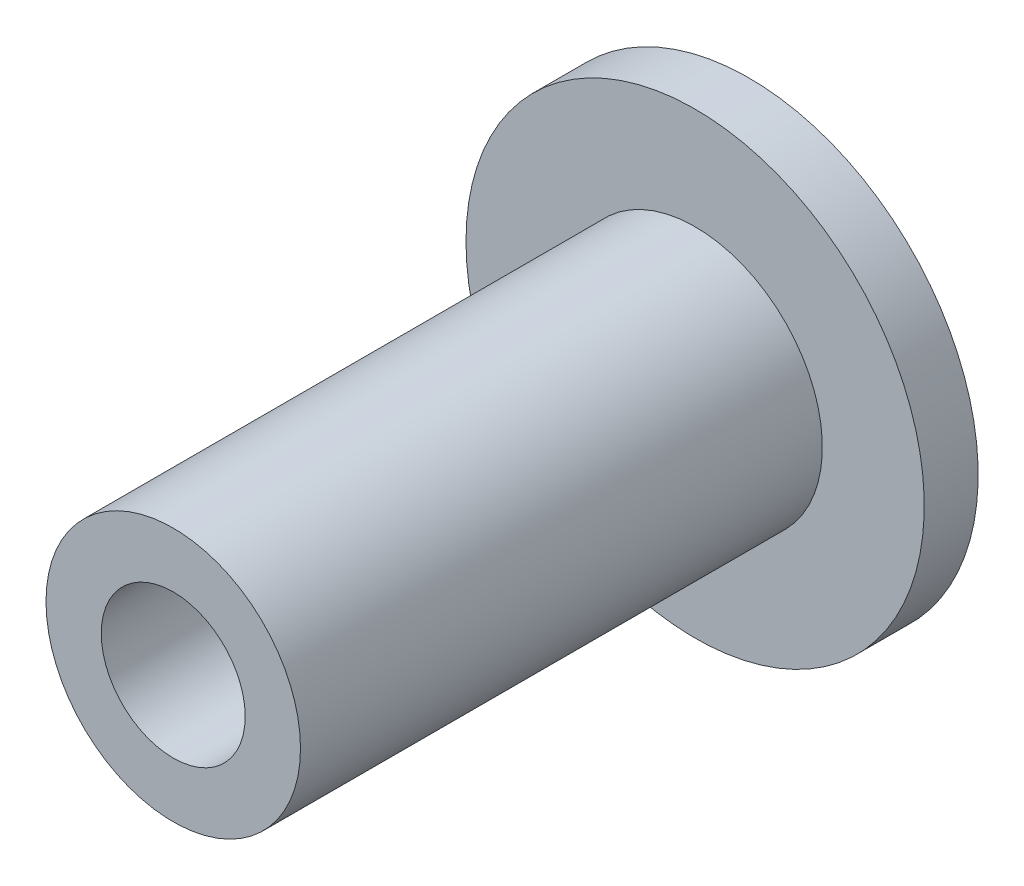
ISO-10303-21;
HEADER;
FILE_DESCRIPTION(('STEP AP214'),'2;1');
FILE_NAME('part.step','',(''),(''),'','','');
FILE_SCHEMA(('AUTOMOTIVE_DESIGN { 1 0 10303 214 1 1 1 1 }'));
ENDSEC;
DATA;
#1=APPLICATION_CONTEXT('core data for automotive mechanical design processes');
#2=APPLICATION_PROTOCOL_DEFINITION('international standard','automotive_design',2000,#1);
#3=PRODUCT_CONTEXT('',#1,'mechanical');
#4=PRODUCT('Part','Part','',(#3));
#5=PRODUCT_RELATED_PRODUCT_CATEGORY('part','',(#4));
#6=PRODUCT_DEFINITION_FORMATION('','',#4);
#7=PRODUCT_DEFINITION_CONTEXT('part definition',#1,'design');
#8=PRODUCT_DEFINITION('design','',#6,#7);
#9=PRODUCT_DEFINITION_SHAPE('','',#8);
#10=(LENGTH_UNIT() NAMED_UNIT(*) SI_UNIT(.MILLI.,.METRE.));
#11=(NAMED_UNIT(*) PLANE_ANGLE_UNIT() SI_UNIT($,.RADIAN.));
#12=(NAMED_UNIT(*) SI_UNIT($,.STERADIAN.) SOLID_ANGLE_UNIT());
#13=UNCERTAINTY_MEASURE_WITH_UNIT(LENGTH_MEASURE(1.E-05),#10,'distance_accuracy_value','');
#14=(GEOMETRIC_REPRESENTATION_CONTEXT(3) GLOBAL_UNCERTAINTY_ASSIGNED_CONTEXT((#13)) GLOBAL_UNIT_ASSIGNED_CONTEXT((#10,
#11,#12)) REPRESENTATION_CONTEXT('',''));
#15=CARTESIAN_POINT('',(0.,0.,0.));
#16=DIRECTION('',(0.,0.,1.));
#17=DIRECTION('',(1.,0.,0.));
#18=AXIS2_PLACEMENT_3D('',#15,#16,#17);
#19=CARTESIAN_POINT('',(0.,0.,10.033));
#20=DIRECTION('',(0.,0.,-1.));
#21=DIRECTION('',(-1.,0.,0.));
#22=AXIS2_PLACEMENT_3D('',#19,#20,#21);
#23=CYLINDRICAL_SURFACE('',#22,5.9944);
#24=CARTESIAN_POINT('',(0.,0.,10.033));
#25=DIRECTION('',(0.,0.,1.));
#26=DIRECTION('',(1.,0.,0.));
#27=AXIS2_PLACEMENT_3D('',#24,#25,#26);
#28=CIRCLE('',#27,5.9944);
#29=CARTESIAN_POINT('',(5.9944,0.,10.033));
#30=VERTEX_POINT('',#29);
#31=EDGE_CURVE('E10',#30,#30,#28,.T.);
#32=ORIENTED_EDGE('',*,*,#31,.F.);
#33=EDGE_LOOP('',(#32));
#34=FACE_BOUND('',#33,.T.);
#35=CARTESIAN_POINT('',(0.,0.,-14.5542));
#36=DIRECTION('',(0.,0.,-1.));
#37=DIRECTION('',(-1.,0.,0.));
#38=AXIS2_PLACEMENT_3D('',#35,#36,#37);
#39=CIRCLE('',#38,5.9944);
#40=CARTESIAN_POINT('',(-5.9944,0.,-14.5542));
#41=VERTEX_POINT('',#40);
#42=EDGE_CURVE('E63',#41,#41,#39,.T.);
#43=ORIENTED_EDGE('',*,*,#42,.F.);
#44=EDGE_LOOP('',(#43));
#45=FACE_BOUND('',#44,.T.);
#46=CARTESIAN_POINT('',(0.,-5.9944,3.7846));
#47=CARTESIAN_POINT('',(-0.130886887564966,-5.99439301047395,3.78459066947051));
#48=CARTESIAN_POINT('',(-0.26197780745453,-5.99006437660331,3.77400109132687));
#49=CARTESIAN_POINT('',(-0.520464069224911,-5.97317559377108,3.73202158823207));
#50=CARTESIAN_POINT('',(-0.64784856916491,-5.96059342244834,3.70057601212357));
#51=CARTESIAN_POINT('',(-0.894753436712238,-5.92854887938121,3.61822188756817));
#52=CARTESIAN_POINT('',(-1.01429838888754,-5.90910936929513,3.56737796580561));
#53=CARTESIAN_POINT('',(-1.24305111550801,-5.86525679802924,3.44793210106671));
#54=CARTESIAN_POINT('',(-1.35226227713629,-5.84084537485882,3.37933600458022));
#55=CARTESIAN_POINT('',(-1.56269275892852,-5.7881866098338,3.2228270746994));
#56=CARTESIAN_POINT('',(-1.66334672333439,-5.7598175298676,3.13419538784217));
#57=CARTESIAN_POINT('',(-1.84884330354453,-5.70298521089813,2.94164952325426));
#58=CARTESIAN_POINT('',(-1.93367795035161,-5.67452193175001,2.83772768999996));
#59=CARTESIAN_POINT('',(-2.08900775439584,-5.61925247309311,2.61170254115946));
#60=CARTESIAN_POINT('',(-2.15865540028879,-5.59258436915329,2.48897953142959));
#61=CARTESIAN_POINT('',(-2.27606719404941,-5.54584285060409,2.2323151859867));
#62=CARTESIAN_POINT('',(-2.32384209058769,-5.52576619820959,2.0983793987985));
#63=CARTESIAN_POINT('',(-2.39384624514471,-5.49579194608517,1.82959303399992));
#64=CARTESIAN_POINT('',(-2.41716027185775,-5.4854643532488,1.69507472212569));
#65=CARTESIAN_POINT('',(-2.44096786332806,-5.47491503998312,1.42366936879247));
#66=CARTESIAN_POINT('',(-2.4414731861731,-5.47468811257264,1.28678358419738));
#67=CARTESIAN_POINT('',(-2.4204690597363,-5.48400012146107,1.02510355843793));
#68=CARTESIAN_POINT('',(-2.40055109422405,-5.49283308204151,0.900151504645107));
#69=CARTESIAN_POINT('',(-2.34192579920706,-5.51808143014421,0.65554661816911));
#70=CARTESIAN_POINT('',(-2.30321506526758,-5.5344981914962,0.53589474993715));
#71=CARTESIAN_POINT('',(-2.20735821709606,-5.57342936141972,0.302343991239938));
#72=CARTESIAN_POINT('',(-2.14984579571161,-5.59606336946918,0.188616273267144));
#73=CARTESIAN_POINT('',(-2.01827599956942,-5.64484789843029,-0.028001996757046));
#74=CARTESIAN_POINT('',(-1.94421228093561,-5.67099976615335,-0.130888371166367));
#75=CARTESIAN_POINT('',(-1.77466500752094,-5.7264263463927,-0.33158590322855));
#76=CARTESIAN_POINT('',(-1.67794007837195,-5.755783314196,-0.428328520856989));
#77=CARTESIAN_POINT('',(-1.46933502974869,-5.81253483626706,-0.604568465272907));
#78=CARTESIAN_POINT('',(-1.35745169142457,-5.83992897183831,-0.684062119934127));
#79=CARTESIAN_POINT('',(-1.11858811131278,-5.89039744588404,-0.825015353178879));
#80=CARTESIAN_POINT('',(-0.991339528561734,-5.91336864732142,-0.88605982928831));
#81=CARTESIAN_POINT('',(-0.727207163586644,-5.95161861589953,-0.985505062524105));
#82=CARTESIAN_POINT('',(-0.590328491624927,-5.96690142835324,-1.02391772939933));
#83=CARTESIAN_POINT('',(-0.319767323622745,-5.98730797373265,-1.07481761109077));
#84=CARTESIAN_POINT('',(-0.186397070893351,-5.99299324122021,-1.08874001120626));
#85=CARTESIAN_POINT('',(0.080883105575183,-5.99534243360918,-1.09451841094271));
#86=CARTESIAN_POINT('',(0.214792873698523,-5.99200879654079,-1.08638037403746));
#87=CARTESIAN_POINT('',(0.472759218251278,-5.97706106180885,-1.04931324131126));
#88=CARTESIAN_POINT('',(0.596983613154315,-5.96584184361111,-1.02137512284999));
#89=CARTESIAN_POINT('',(0.838858673744933,-5.93666555489665,-0.946861654349843));
#90=CARTESIAN_POINT('',(0.956508497911473,-5.9187076241085,-0.900283924707315));
#91=CARTESIAN_POINT('',(1.18597893499103,-5.87710036862634,-0.788290984311527));
#92=CARTESIAN_POINT('',(1.29750821052025,-5.85329271787953,-0.722339532234388));
#93=CARTESIAN_POINT('',(1.5083119469273,-5.80255125413318,-0.574063733842812));
#94=CARTESIAN_POINT('',(1.60758138047034,-5.77561616740695,-0.491732706727733));
#95=CARTESIAN_POINT('',(1.79815842987715,-5.71926553558528,-0.306453335417239));
#96=CARTESIAN_POINT('',(1.88846071067632,-5.68980613883182,-0.202481563982998));
#97=CARTESIAN_POINT('',(2.05059641815415,-5.63340693827743,0.0196411955226845));
#98=CARTESIAN_POINT('',(2.12242635636836,-5.60646761099677,0.137794855644791));
#99=CARTESIAN_POINT('',(2.24615685305721,-5.55806584310736,0.386965599916293));
#100=CARTESIAN_POINT('',(2.29781971208243,-5.53666967035847,0.518114522857342));
#101=CARTESIAN_POINT('',(2.37791194077361,-5.50275327168747,0.788388005565465));
#102=CARTESIAN_POINT('',(2.40635926061291,-5.49022618921054,0.927506314185734));
#103=CARTESIAN_POINT('',(2.43746986061205,-5.47648012464231,1.1986725506339));
#104=CARTESIAN_POINT('',(2.44188589205581,-5.47449271799031,1.33048155518679));
#105=CARTESIAN_POINT('',(2.4294422133011,-5.48002634629648,1.59287457013769));
#106=CARTESIAN_POINT('',(2.41258541982616,-5.4875460777283,1.7234587459994));
#107=CARTESIAN_POINT('',(2.35952288372346,-5.51055882968726,1.97402318700019));
#108=CARTESIAN_POINT('',(2.32416567435,-5.52570116198278,2.09421834650013));
#109=CARTESIAN_POINT('',(2.23591420619935,-5.56199458244378,2.32701065855502));
#110=CARTESIAN_POINT('',(2.1830150688917,-5.58314734191577,2.43960568696558));
#111=CARTESIAN_POINT('',(2.05761194261521,-5.63061298999345,2.66117826166334));
#112=CARTESIAN_POINT('',(1.98414261271039,-5.65715525426382,2.76955949348688));
#113=CARTESIAN_POINT('',(1.82107455161282,-5.71173421523815,2.97300453171964));
#114=CARTESIAN_POINT('',(1.73147065912223,-5.73977138812354,3.06806405928421));
#115=CARTESIAN_POINT('',(1.53141829382244,-5.79647256140869,3.24880976334045));
#116=CARTESIAN_POINT('',(1.41996656919294,-5.82504948743264,3.33341861345493));
#117=CARTESIAN_POINT('',(1.18340899217525,-5.87767503019671,3.48276774604191));
#118=CARTESIAN_POINT('',(1.05829688864781,-5.9017215599435,3.5474988801609));
#119=CARTESIAN_POINT('',(0.799961266708152,-5.94218870245711,3.65378824250297));
#120=CARTESIAN_POINT('',(0.666922500974959,-5.95873783008602,3.69573964879571));
#121=CARTESIAN_POINT('',(0.463234681390629,-5.97686612263372,3.74120794137591));
#122=CARTESIAN_POINT('',(0.394713360075828,-5.98179157038646,3.7534510771913));
#123=CARTESIAN_POINT('',(0.256759690731918,-5.98929477703823,3.77203914813661));
#124=CARTESIAN_POINT('',(0.187328005554844,-5.99187415726971,3.77838815667327));
#125=CARTESIAN_POINT('',(0.0785416806855929,-5.99401497056573,3.78365270072847));
#126=CARTESIAN_POINT('',(0.0392800283279682,-5.99440209760341,3.78460280015416));
#127=CARTESIAN_POINT('',(0.,-5.9944,3.7846));
#128=B_SPLINE_CURVE_WITH_KNOTS('',3,(#46,#47,#48,#49,#50,#51,#52,#53,#54,#55,#56,#57,#58,#59,
#60,#61,#62,#63,#64,#65,#66,#67,#68,#69,#70,#71,#72,#73,#74,#75,#76,#77,#78,#79,#80,#81,#82,#83,
#84,#85,#86,#87,#88,#89,#90,#91,#92,#93,#94,#95,#96,#97,#98,#99,#100,#101,#102,#103,#104,#105,
#106,#107,#108,#109,#110,#111,#112,#113,#114,#115,#116,#117,#118,#119,#120,#121,#122,#123,#124,
#125,#126,#127),.UNSPECIFIED.,.T.,.F.,(4,2,2,2,2,2,2,2,2,2,2,2,2,2,2,2,2,2,2,2,2,2,2,2,2,2,2,2,
2,2,2,2,2,2,2,2,2,2,2,2,4),(0.,0.39252729774372,0.786106233455745,1.17838522953526,
1.57053519674922,1.9799905588279,2.38965163050852,2.81831200124294,3.24676149369655,
3.65528406923982,4.06359604539011,4.44234133938418,4.82115527121974,5.2078395060688,
5.594672206445,6.01252419878205,6.43046506040938,6.85720868540431,7.28372754006026,
7.68429567304518,8.08475553349959,8.46647142826327,8.84823606988368,9.24176461891839,
9.63545400825607,10.0560042386037,10.4766338307855,10.902081405337,11.3271997128189,
11.7208492180858,12.1144447558126,12.491392888209,12.8684459405071,13.2675422980656,
13.6667665504104,14.0931449120524,14.519719213413,14.9386757590115,15.1477816687357,
15.3567429584245,15.4745430196966),.UNSPECIFIED.);
#129=CARTESIAN_POINT('',(0.,-5.9944,3.7846));
#130=VERTEX_POINT('',#129);
#131=EDGE_CURVE('E80',#130,#130,#128,.T.);
#132=ORIENTED_EDGE('',*,*,#131,.F.);
#133=EDGE_LOOP('',(#132));
#134=FACE_BOUND('',#133,.T.);
#135=ADVANCED_FACE('F43',(#34,#45,#134),#23,.T.);
#136=CARTESIAN_POINT('',(0.,0.,10.033));
#137=DIRECTION('',(0.,0.,-1.));
#138=DIRECTION('',(-1.,0.,0.));
#139=AXIS2_PLACEMENT_3D('',#136,#137,#138);
#140=CYLINDRICAL_SURFACE('',#139,3.3909);
#141=CARTESIAN_POINT('',(0.,0.,-17.0942));
#142=DIRECTION('',(0.,0.,-1.));
#143=DIRECTION('',(-1.,0.,0.));
#144=AXIS2_PLACEMENT_3D('',#141,#142,#143);
#145=CIRCLE('',#144,3.3909);
#146=CARTESIAN_POINT('',(-3.3909,0.,-17.0942));
#147=VERTEX_POINT('',#146);
#148=EDGE_CURVE('E76',#147,#147,#145,.T.);
#149=ORIENTED_EDGE('',*,*,#148,.T.);
#150=EDGE_LOOP('',(#149));
#151=FACE_BOUND('',#150,.T.);
#152=CARTESIAN_POINT('',(0.,0.,10.033));
#153=DIRECTION('',(0.,0.,1.));
#154=DIRECTION('',(1.,0.,0.));
#155=AXIS2_PLACEMENT_3D('',#152,#153,#154);
#156=CIRCLE('',#155,3.3909);
#157=CARTESIAN_POINT('',(3.3909,0.,10.033));
#158=VERTEX_POINT('',#157);
#159=EDGE_CURVE('E57',#158,#158,#156,.T.);
#160=ORIENTED_EDGE('',*,*,#159,.T.);
#161=EDGE_LOOP('',(#160));
#162=FACE_BOUND('',#161,.T.);
#163=CARTESIAN_POINT('',(0.,-3.3909,3.7846));
#164=CARTESIAN_POINT('',(-0.120510131857021,-3.39090511226414,3.78460550239903));
#165=CARTESIAN_POINT('',(-0.240992365872244,-3.38442428079192,3.77561808965648));
#166=CARTESIAN_POINT('',(-0.478053993077699,-3.35914922137523,3.74028173700238));
#167=CARTESIAN_POINT('',(-0.594632030680575,-3.34035076224123,3.71392683122018));
#168=CARTESIAN_POINT('',(-0.820068546932916,-3.29225307215049,3.64557083916231));
#169=CARTESIAN_POINT('',(-0.928962391308479,-3.26300629749181,3.60364787234912));
#170=CARTESIAN_POINT('',(-1.13759039726306,-3.19626384832928,3.50605196088222));
#171=CARTESIAN_POINT('',(-1.23732328119222,-3.15876702568614,3.4503771022785));
#172=CARTESIAN_POINT('',(-1.43497075232357,-3.0743494804552,3.32149931915913));
#173=CARTESIAN_POINT('',(-1.53191284194314,-3.02688419402828,3.24716945010823));
#174=CARTESIAN_POINT('',(-1.71281215538571,-2.9283295717289,3.08596371669134));
#175=CARTESIAN_POINT('',(-1.79674949181126,-2.8772348562464,2.99906902240662));
#176=CARTESIAN_POINT('',(-1.96534926556743,-2.76543403720902,2.796604637371));
#177=CARTESIAN_POINT('',(-2.04722586097167,-2.70471307588229,2.67870964158073));
#178=CARTESIAN_POINT('',(-2.19014733792194,-2.59032985833734,2.42778372727253));
#179=CARTESIAN_POINT('',(-2.2512249304665,-2.53665660051916,2.29477701879603));
#180=CARTESIAN_POINT('',(-2.33363455434843,-2.46057447068893,2.06032251995281));
#181=CARTESIAN_POINT('',(-2.36143250281094,-2.43367118899389,1.96262527881524));
#182=CARTESIAN_POINT('',(-2.40480685926309,-2.39082604099109,1.76231563596528));
#183=CARTESIAN_POINT('',(-2.42040959188598,-2.37486057353879,1.65971433142825));
#184=CARTESIAN_POINT('',(-2.43838379192605,-2.35641181353337,1.45138042926221));
#185=CARTESIAN_POINT('',(-2.4406652945238,-2.35402019488019,1.34563137759886));
#186=CARTESIAN_POINT('',(-2.43154908668454,-2.3634302016515,1.13533235473615));
#187=CARTESIAN_POINT('',(-2.42014049334287,-2.37524311894876,1.03078340429014));
#188=CARTESIAN_POINT('',(-2.38235908519635,-2.41316093437235,0.813474781968057));
#189=CARTESIAN_POINT('',(-2.35431230097116,-2.44085062003865,0.701295540169296));
#190=CARTESIAN_POINT('',(-2.28400336159084,-2.50675880081634,0.484715964176813));
#191=CARTESIAN_POINT('',(-2.24170920493009,-2.54500096291531,0.380333793878788));
#192=CARTESIAN_POINT('',(-2.12890356259327,-2.64064812687593,0.148227989190538));
#193=CARTESIAN_POINT('',(-2.05369378441207,-2.70027075189954,0.0237114339603397));
#194=CARTESIAN_POINT('',(-1.88321238568103,-2.82182858835895,-0.209496291258305));
#195=CARTESIAN_POINT('',(-1.787920267837,-2.88376610897665,-0.318171098967873));
#196=CARTESIAN_POINT('',(-1.57716957144278,-3.00427122134659,-0.519209453118687));
#197=CARTESIAN_POINT('',(-1.46150481372837,-3.06279532437023,-0.61138468100104));
#198=CARTESIAN_POINT('',(-1.21219041295227,-3.1697134399386,-0.774760715094408));
#199=CARTESIAN_POINT('',(-1.07858305427825,-3.2181306057051,-0.846009615837444));
#200=CARTESIAN_POINT('',(-0.832594041217747,-3.28891213866272,-0.948471470917665));
#201=CARTESIAN_POINT('',(-0.72353494179048,-3.31477296142874,-0.985264277920814));
#202=CARTESIAN_POINT('',(-0.499424092882594,-3.35584788635797,-1.04330484768109));
#203=CARTESIAN_POINT('',(-0.384376790001447,-3.37106977072475,-1.06456397358167));
#204=CARTESIAN_POINT('',(-0.151055703859422,-3.38956062934246,-1.09035388397408));
#205=CARTESIAN_POINT('',(-0.032772447737085,-3.39278960990251,-1.0948286969709));
#206=CARTESIAN_POINT('',(0.202886903489984,-3.3868764815897,-1.08660340026116));
#207=CARTESIAN_POINT('',(0.320262921276882,-3.37773332976329,-1.07390184261047));
#208=CARTESIAN_POINT('',(0.544628439682804,-3.3486926568281,-1.03319548218151));
#209=CARTESIAN_POINT('',(0.651842718511451,-3.32936468465171,-1.00600033943656));
#210=CARTESIAN_POINT('',(0.859818215416288,-3.28181467050271,-0.938199650376709));
#211=CARTESIAN_POINT('',(0.960578107492356,-3.25359080794964,-0.897591358924256));
#212=CARTESIAN_POINT('',(1.16256691170258,-3.18730568956067,-0.800398646998452));
#213=CARTESIAN_POINT('',(1.26305227985727,-3.14859603390282,-0.742720485893404));
#214=CARTESIAN_POINT('',(1.45330791890769,-3.06543635568419,-0.615134510793003));
#215=CARTESIAN_POINT('',(1.54307022681871,-3.02098211754662,-0.545217702153065));
#216=CARTESIAN_POINT('',(1.7265142731382,-2.92064457580465,-0.380865525269685));
#217=CARTESIAN_POINT('',(1.81794086796266,-2.86415289086994,-0.284283549762545));
#218=CARTESIAN_POINT('',(1.98415863897799,-2.75161513935701,-0.0773658272647317));
#219=CARTESIAN_POINT('',(2.05893923364988,-2.69556937794358,0.0329785990979532));
#220=CARTESIAN_POINT('',(2.18110872324855,-2.59734562516423,0.24995234088317));
#221=CARTESIAN_POINT('',(2.23088662419569,-2.55433105090935,0.354850988203598));
#222=CARTESIAN_POINT('',(2.31572750527125,-2.47767760814026,0.573610681546666));
#223=CARTESIAN_POINT('',(2.35082152231212,-2.44401901525302,0.687452213664617));
#224=CARTESIAN_POINT('',(2.39903256167471,-2.39661573736108,0.899221913235879));
#225=CARTESIAN_POINT('',(2.41511536441062,-2.3802556761467,0.995873048149068));
#226=CARTESIAN_POINT('',(2.43547862059919,-2.35942249790517,1.19163458945356));
#227=CARTESIAN_POINT('',(2.43977361262722,-2.3549347383421,1.29074181416479));
#228=CARTESIAN_POINT('',(2.4362522137227,-2.35857598897525,1.4885511531747));
#229=CARTESIAN_POINT('',(2.42842885553185,-2.36671225716575,1.58725300169075));
#230=CARTESIAN_POINT('',(2.40124439864475,-2.39428211867338,1.78148610875586));
#231=CARTESIAN_POINT('',(2.38186525447855,-2.41373338027487,1.87701216115046));
#232=CARTESIAN_POINT('',(2.32459805866025,-2.4691068827414,2.09342326747422));
#233=CARTESIAN_POINT('',(2.28273053534655,-2.50833474868076,2.21239096763003));
#234=CARTESIAN_POINT('',(2.18294239164406,-2.59564179154191,2.43984161382978));
#235=CARTESIAN_POINT('',(2.12499492209276,-2.64373572692272,2.54830661099401));
#236=CARTESIAN_POINT('',(1.99270307079842,-2.74489860961975,2.75709019043378));
#237=CARTESIAN_POINT('',(1.9179462346493,-2.79806893818878,2.85709696316452));
#238=CARTESIAN_POINT('',(1.75387396042095,-2.90373320721948,3.04480684541121));
#239=CARTESIAN_POINT('',(1.6645534510534,-2.95622690517297,3.13250564924399));
#240=CARTESIAN_POINT('',(1.45379167970423,-3.06616036264326,3.30951542221234));
#241=CARTESIAN_POINT('',(1.32946871542772,-3.12267408874085,3.39602867361472));
#242=CARTESIAN_POINT('',(1.06300907363255,-3.22310100454232,3.54598643444176));
#243=CARTESIAN_POINT('',(0.92089811556938,-3.26703209170956,3.60946374472775));
#244=CARTESIAN_POINT('',(0.649687608707201,-3.33045266618485,3.69999347442849));
#245=CARTESIAN_POINT('',(0.522783541205905,-3.35290291863069,3.73152156591926));
#246=CARTESIAN_POINT('',(0.263904198402809,-3.38311473340341,3.77380901529075));
#247=CARTESIAN_POINT('',(0.131935379980629,-3.39089440305556,3.78459397593301));
#248=CARTESIAN_POINT('',(0.,-3.3909,3.7846));
#249=B_SPLINE_CURVE_WITH_KNOTS('',3,(#163,#164,#165,#166,#167,#168,#169,#170,#171,#172,#173,
#174,#175,#176,#177,#178,#179,#180,#181,#182,#183,#184,#185,#186,#187,#188,#189,#190,#191,#192,
#193,#194,#195,#196,#197,#198,#199,#200,#201,#202,#203,#204,#205,#206,#207,#208,#209,#210,#211,
#212,#213,#214,#215,#216,#217,#218,#219,#220,#221,#222,#223,#224,#225,#226,#227,#228,#229,#230,
#231,#232,#233,#234,#235,#236,#237,#238,#239,#240,#241,#242,#243,#244,#245,#246,#247,#248),
.UNSPECIFIED.,.T.,.F.,(4,2,2,2,2,2,2,2,2,2,2,2,2,2,2,2,2,2,2,2,2,2,2,2,2,2,2,2,2,2,2,2,2,2,2,2,
2,2,2,2,2,2,4),(0.,0.360995252114135,0.72211457362605,1.08144578450293,1.4408270343043,
1.83257103362403,2.22490831333327,2.69043629775224,3.15522871882518,3.46931677948355,
3.78272496165204,4.09824731724213,4.41402066272401,4.76878928113203,5.12436013036195,
5.59361224765026,6.06334565297371,6.53813911378085,7.01183267134642,7.36425823451991,
7.71642573378468,8.06976658497092,8.42313722415564,8.75856777194879,9.09406701160125,
9.45917814068521,9.82455873906365,10.2563774945491,10.6884699693545,11.0586879994898,
11.4281195081658,11.7248510789448,12.0212165090357,12.3177523931074,12.6147525636175,
13.008833703223,13.4035768527405,13.8093359585137,14.2152366585987,14.6974619383242,
15.1789978583769,15.5747068479017,15.9699271088453),.UNSPECIFIED.);
#250=CARTESIAN_POINT('',(0.,-3.3909,3.7846));
#251=VERTEX_POINT('',#250);
#252=EDGE_CURVE('E47',#251,#251,#249,.T.);
#253=ORIENTED_EDGE('',*,*,#252,.T.);
#254=EDGE_LOOP('',(#253));
#255=FACE_BOUND('',#254,.T.);
#256=ADVANCED_FACE('F104',(#151,#162,#255),#140,.F.);
#257=CARTESIAN_POINT('',(0.,0.,10.033));
#258=DIRECTION('',(0.,0.,1.));
#259=DIRECTION('',(1.,0.,0.));
#260=AXIS2_PLACEMENT_3D('',#257,#258,#259);
#261=PLANE('',#260);
#262=ORIENTED_EDGE('',*,*,#31,.T.);
#263=EDGE_LOOP('',(#262));
#264=FACE_BOUND('',#263,.T.);
#265=ORIENTED_EDGE('',*,*,#159,.F.);
#266=EDGE_LOOP('',(#265));
#267=FACE_BOUND('',#266,.T.);
#268=ADVANCED_FACE('F102',(#264,#267),#261,.T.);
#269=CARTESIAN_POINT('',(-5.9944,0.,-14.5542));
#270=DIRECTION('',(0.,0.,1.));
#271=DIRECTION('',(1.,0.,0.));
#272=AXIS2_PLACEMENT_3D('',#269,#270,#271);
#273=PLANE('',#272);
#274=ORIENTED_EDGE('',*,*,#42,.T.);
#275=EDGE_LOOP('',(#274));
#276=FACE_BOUND('',#275,.T.);
#277=CARTESIAN_POINT('',(0.,0.,-14.5542));
#278=DIRECTION('',(0.,0.,-1.));
#279=DIRECTION('',(-1.,0.,0.));
#280=AXIS2_PLACEMENT_3D('',#277,#278,#279);
#281=CIRCLE('',#280,10.795);
#282=CARTESIAN_POINT('',(-10.795,0.,-14.5542));
#283=VERTEX_POINT('',#282);
#284=EDGE_CURVE('E69',#283,#283,#281,.T.);
#285=ORIENTED_EDGE('',*,*,#284,.F.);
#286=EDGE_LOOP('',(#285));
#287=FACE_BOUND('',#286,.T.);
#288=ADVANCED_FACE('F99',(#276,#287),#273,.T.);
#289=CARTESIAN_POINT('',(0.,0.,0.));
#290=DIRECTION('',(0.,0.,-1.));
#291=DIRECTION('',(-1.,0.,0.));
#292=AXIS2_PLACEMENT_3D('',#289,#290,#291);
#293=CYLINDRICAL_SURFACE('',#292,10.795);
#294=ORIENTED_EDGE('',*,*,#284,.T.);
#295=EDGE_LOOP('',(#294));
#296=FACE_BOUND('',#295,.T.);
#297=CARTESIAN_POINT('',(0.,0.,-17.0942));
#298=DIRECTION('',(0.,0.,-1.));
#299=DIRECTION('',(-1.,0.,0.));
#300=AXIS2_PLACEMENT_3D('',#297,#298,#299);
#301=CIRCLE('',#300,10.795);
#302=CARTESIAN_POINT('',(-10.795,0.,-17.0942));
#303=VERTEX_POINT('',#302);
#304=EDGE_CURVE('E72',#303,#303,#301,.T.);
#305=ORIENTED_EDGE('',*,*,#304,.F.);
#306=EDGE_LOOP('',(#305));
#307=FACE_BOUND('',#306,.T.);
#308=ADVANCED_FACE('F95',(#296,#307),#293,.T.);
#309=CARTESIAN_POINT('',(-10.795,0.,-17.0942));
#310=DIRECTION('',(0.,0.,-1.));
#311=DIRECTION('',(-1.,0.,0.));
#312=AXIS2_PLACEMENT_3D('',#309,#310,#311);
#313=PLANE('',#312);
#314=ORIENTED_EDGE('',*,*,#304,.T.);
#315=EDGE_LOOP('',(#314));
#316=FACE_BOUND('',#315,.T.);
#317=ORIENTED_EDGE('',*,*,#148,.F.);
#318=EDGE_LOOP('',(#317));
#319=FACE_BOUND('',#318,.T.);
#320=ADVANCED_FACE('F90',(#316,#319),#313,.T.);
#321=CARTESIAN_POINT('',(0.,-10.795,1.3462));
#322=DIRECTION('',(0.,1.,0.));
#323=DIRECTION('',(0.,0.,1.));
#324=AXIS2_PLACEMENT_3D('',#321,#322,#323);
#325=CYLINDRICAL_SURFACE('',#324,2.4384);
#326=ORIENTED_EDGE('',*,*,#252,.F.);
#327=EDGE_LOOP('',(#326));
#328=FACE_BOUND('',#327,.T.);
#329=ORIENTED_EDGE('',*,*,#131,.T.);
#330=EDGE_LOOP('',(#329));
#331=FACE_BOUND('',#330,.T.);
#332=ADVANCED_FACE('F86',(#328,#331),#325,.F.);
#333=CLOSED_SHELL('',(#135,#256,#268,#288,#308,#320,#332));
#334=MANIFOLD_SOLID_BREP('B2',#333);
#335=ADVANCED_BREP_SHAPE_REPRESENTATION('',(#18,#334),#14);
#336=SHAPE_DEFINITION_REPRESENTATION(#9,#335);
ENDSEC;
END-ISO-10303-21;
